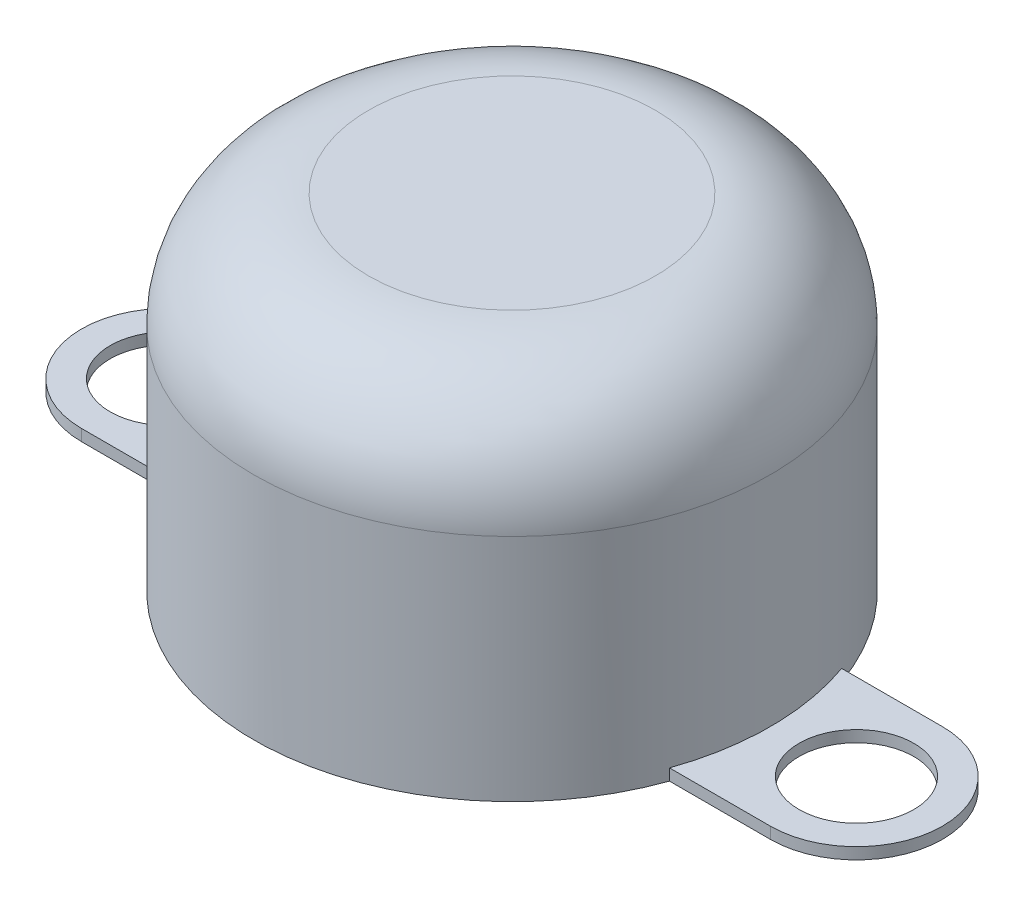
ISO-10303-21;
HEADER;
FILE_DESCRIPTION(('STEP AP214'),'2;1');
FILE_NAME('part.step','',(''),(''),'','','');
FILE_SCHEMA(('AUTOMOTIVE_DESIGN { 1 0 10303 214 1 1 1 1 }'));
ENDSEC;
DATA;
#1=APPLICATION_CONTEXT('core data for automotive mechanical design processes');
#2=APPLICATION_PROTOCOL_DEFINITION('international standard','automotive_design',2000,#1);
#3=PRODUCT_CONTEXT('',#1,'mechanical');
#4=PRODUCT('Part','Part','',(#3));
#5=PRODUCT_RELATED_PRODUCT_CATEGORY('part','',(#4));
#6=PRODUCT_DEFINITION_FORMATION('','',#4);
#7=PRODUCT_DEFINITION_CONTEXT('part definition',#1,'design');
#8=PRODUCT_DEFINITION('design','',#6,#7);
#9=PRODUCT_DEFINITION_SHAPE('','',#8);
#10=(LENGTH_UNIT() NAMED_UNIT(*) SI_UNIT(.MILLI.,.METRE.));
#11=(NAMED_UNIT(*) PLANE_ANGLE_UNIT() SI_UNIT($,.RADIAN.));
#12=(NAMED_UNIT(*) SI_UNIT($,.STERADIAN.) SOLID_ANGLE_UNIT());
#13=UNCERTAINTY_MEASURE_WITH_UNIT(LENGTH_MEASURE(1.E-05),#10,'distance_accuracy_value','');
#14=(GEOMETRIC_REPRESENTATION_CONTEXT(3) GLOBAL_UNCERTAINTY_ASSIGNED_CONTEXT((#13)) GLOBAL_UNIT_ASSIGNED_CONTEXT((#10,
#11,#12)) REPRESENTATION_CONTEXT('',''));
#15=CARTESIAN_POINT('',(0.,0.,0.));
#16=DIRECTION('',(0.,0.,1.));
#17=DIRECTION('',(1.,0.,0.));
#18=AXIS2_PLACEMENT_3D('',#15,#16,#17);
#19=CARTESIAN_POINT('',(0.,30.,0.));
#20=DIRECTION('',(0.,-1.,0.));
#21=DIRECTION('',(0.,0.,-1.));
#22=AXIS2_PLACEMENT_3D('',#19,#20,#21);
#23=CYLINDRICAL_SURFACE('',#22,22.5);
#24=CARTESIAN_POINT('',(0.,20.,0.));
#25=DIRECTION('',(0.,1.,0.));
#26=DIRECTION('',(0.,0.,1.));
#27=AXIS2_PLACEMENT_3D('',#24,#25,#26);
#28=CIRCLE('',#27,22.5);
#29=CARTESIAN_POINT('',(0.,20.,22.5));
#30=VERTEX_POINT('',#29);
#31=EDGE_CURVE('E11',#30,#30,#28,.F.);
#32=ORIENTED_EDGE('',*,*,#31,.T.);
#33=EDGE_LOOP('',(#32));
#34=FACE_BOUND('',#33,.T.);
#35=DIRECTION('',(0.,-1.,0.));
#36=VECTOR('',#35,1.);
#37=CARTESIAN_POINT('',(21.2132034355964,1.,7.5));
#38=LINE('',#37,#36);
#39=CARTESIAN_POINT('',(21.2132034355964,1.,7.5));
#40=VERTEX_POINT('',#39);
#41=CARTESIAN_POINT('',(21.2132034355964,0.,7.5));
#42=VERTEX_POINT('',#41);
#43=EDGE_CURVE('E56',#40,#42,#38,.T.);
#44=ORIENTED_EDGE('',*,*,#43,.F.);
#45=CARTESIAN_POINT('',(0.,1.,0.));
#46=DIRECTION('',(0.,-1.,0.));
#47=DIRECTION('',(0.,0.,1.));
#48=AXIS2_PLACEMENT_3D('',#45,#46,#47);
#49=CIRCLE('',#48,22.5);
#50=CARTESIAN_POINT('',(21.2132034355964,1.,-7.5));
#51=VERTEX_POINT('',#50);
#52=EDGE_CURVE('E51',#51,#40,#49,.T.);
#53=ORIENTED_EDGE('',*,*,#52,.F.);
#54=DIRECTION('',(0.,-1.,0.));
#55=VECTOR('',#54,1.);
#56=CARTESIAN_POINT('',(21.2132034355964,1.,-7.5));
#57=LINE('',#56,#55);
#58=CARTESIAN_POINT('',(21.2132034355964,0.,-7.5));
#59=VERTEX_POINT('',#58);
#60=EDGE_CURVE('E138',#51,#59,#57,.T.);
#61=ORIENTED_EDGE('',*,*,#60,.T.);
#62=CARTESIAN_POINT('',(0.,0.,0.));
#63=DIRECTION('',(0.,1.,0.));
#64=DIRECTION('',(0.,0.,1.));
#65=AXIS2_PLACEMENT_3D('',#62,#63,#64);
#66=CIRCLE('',#65,22.5);
#67=CARTESIAN_POINT('',(-21.2132034355964,0.,-7.5));
#68=VERTEX_POINT('',#67);
#69=EDGE_CURVE('E180',#59,#68,#66,.T.);
#70=ORIENTED_EDGE('',*,*,#69,.T.);
#71=DIRECTION('',(0.,-1.,0.));
#72=VECTOR('',#71,1.);
#73=CARTESIAN_POINT('',(-21.2132034355964,1.,-7.5));
#74=LINE('',#73,#72);
#75=CARTESIAN_POINT('',(-21.2132034355964,1.,-7.5));
#76=VERTEX_POINT('',#75);
#77=EDGE_CURVE('E170',#76,#68,#74,.T.);
#78=ORIENTED_EDGE('',*,*,#77,.F.);
#79=CARTESIAN_POINT('',(0.,1.,0.));
#80=DIRECTION('',(0.,1.,0.));
#81=DIRECTION('',(0.,0.,1.));
#82=AXIS2_PLACEMENT_3D('',#79,#80,#81);
#83=CIRCLE('',#82,22.5);
#84=CARTESIAN_POINT('',(-21.2132034355964,1.,7.5));
#85=VERTEX_POINT('',#84);
#86=EDGE_CURVE('E148',#76,#85,#83,.T.);
#87=ORIENTED_EDGE('',*,*,#86,.T.);
#88=DIRECTION('',(0.,-1.,0.));
#89=VECTOR('',#88,1.);
#90=CARTESIAN_POINT('',(-21.2132034355964,1.,7.5));
#91=LINE('',#90,#89);
#92=CARTESIAN_POINT('',(-21.2132034355964,0.,7.5));
#93=VERTEX_POINT('',#92);
#94=EDGE_CURVE('E173',#85,#93,#91,.T.);
#95=ORIENTED_EDGE('',*,*,#94,.T.);
#96=EDGE_CURVE('E186',#93,#42,#66,.T.);
#97=ORIENTED_EDGE('',*,*,#96,.T.);
#98=EDGE_LOOP('',(#44,#53,#61,#70,#78,#87,#95,#97));
#99=FACE_BOUND('',#98,.T.);
#100=ADVANCED_FACE('F36',(#34,#99),#23,.T.);
#101=CARTESIAN_POINT('',(0.,30.,0.));
#102=DIRECTION('',(0.,1.,0.));
#103=DIRECTION('',(0.,0.,1.));
#104=AXIS2_PLACEMENT_3D('',#101,#102,#103);
#105=PLANE('',#104);
#106=CARTESIAN_POINT('',(0.,30.,0.));
#107=DIRECTION('',(0.,1.,0.));
#108=DIRECTION('',(0.,0.,1.));
#109=AXIS2_PLACEMENT_3D('',#106,#107,#108);
#110=CIRCLE('',#109,12.5);
#111=CARTESIAN_POINT('',(0.,30.,12.5));
#112=VERTEX_POINT('',#111);
#113=EDGE_CURVE('E44',#112,#112,#110,.T.);
#114=ORIENTED_EDGE('',*,*,#113,.T.);
#115=EDGE_LOOP('',(#114));
#116=FACE_BOUND('',#115,.T.);
#117=ADVANCED_FACE('F190',(#116),#105,.T.);
#118=CARTESIAN_POINT('',(0.,0.,0.));
#119=DIRECTION('',(0.,1.,0.));
#120=DIRECTION('',(0.,0.,1.));
#121=AXIS2_PLACEMENT_3D('',#118,#119,#120);
#122=PLANE('',#121);
#123=CARTESIAN_POINT('',(0.,0.,0.));
#124=DIRECTION('',(0.,1.,0.));
#125=DIRECTION('',(0.,0.,1.));
#126=AXIS2_PLACEMENT_3D('',#123,#124,#125);
#127=CIRCLE('',#126,21.5);
#128=CARTESIAN_POINT('',(0.,0.,21.5));
#129=VERTEX_POINT('',#128);
#130=EDGE_CURVE('E176',#129,#129,#127,.T.);
#131=ORIENTED_EDGE('',*,*,#130,.T.);
#132=EDGE_LOOP('',(#131));
#133=FACE_BOUND('',#132,.T.);
#134=ORIENTED_EDGE('',*,*,#96,.F.);
#135=DIRECTION('',(-1.,0.,0.));
#136=VECTOR('',#135,1.);
#137=CARTESIAN_POINT('',(0.,0.,7.5));
#138=LINE('',#137,#136);
#139=CARTESIAN_POINT('',(-30.,0.,7.5));
#140=VERTEX_POINT('',#139);
#141=EDGE_CURVE('E158',#93,#140,#138,.T.);
#142=ORIENTED_EDGE('',*,*,#141,.T.);
#143=CARTESIAN_POINT('',(-30.,0.,0.));
#144=DIRECTION('',(0.,1.,0.));
#145=DIRECTION('',(0.,0.,1.));
#146=AXIS2_PLACEMENT_3D('',#143,#144,#145);
#147=CIRCLE('',#146,7.5);
#148=CARTESIAN_POINT('',(-30.,0.,-7.5));
#149=VERTEX_POINT('',#148);
#150=EDGE_CURVE('E145',#149,#140,#147,.T.);
#151=ORIENTED_EDGE('',*,*,#150,.F.);
#152=DIRECTION('',(-1.,0.,0.));
#153=VECTOR('',#152,1.);
#154=CARTESIAN_POINT('',(0.,0.,-7.5));
#155=LINE('',#154,#153);
#156=EDGE_CURVE('E161',#68,#149,#155,.T.);
#157=ORIENTED_EDGE('',*,*,#156,.F.);
#158=ORIENTED_EDGE('',*,*,#69,.F.);
#159=DIRECTION('',(1.,0.,0.));
#160=VECTOR('',#159,1.);
#161=CARTESIAN_POINT('',(0.,0.,-7.5));
#162=LINE('',#161,#160);
#163=CARTESIAN_POINT('',(30.,0.,-7.5));
#164=VERTEX_POINT('',#163);
#165=EDGE_CURVE('E134',#59,#164,#162,.T.);
#166=ORIENTED_EDGE('',*,*,#165,.T.);
#167=CARTESIAN_POINT('',(30.,0.,0.));
#168=DIRECTION('',(0.,-1.,0.));
#169=DIRECTION('',(0.,0.,1.));
#170=AXIS2_PLACEMENT_3D('',#167,#168,#169);
#171=CIRCLE('',#170,7.5);
#172=CARTESIAN_POINT('',(30.,0.,7.5));
#173=VERTEX_POINT('',#172);
#174=EDGE_CURVE('E132',#164,#173,#171,.T.);
#175=ORIENTED_EDGE('',*,*,#174,.T.);
#176=DIRECTION('',(1.,0.,0.));
#177=VECTOR('',#176,1.);
#178=CARTESIAN_POINT('',(0.,0.,7.5));
#179=LINE('',#178,#177);
#180=EDGE_CURVE('E114',#42,#173,#179,.T.);
#181=ORIENTED_EDGE('',*,*,#180,.F.);
#182=EDGE_LOOP('',(#134,#142,#151,#157,#158,#166,#175,#181));
#183=FACE_BOUND('',#182,.T.);
#184=CARTESIAN_POINT('',(-30.,0.,0.));
#185=DIRECTION('',(0.,1.,0.));
#186=DIRECTION('',(0.,0.,1.));
#187=AXIS2_PLACEMENT_3D('',#184,#185,#186);
#188=CIRCLE('',#187,5.);
#189=CARTESIAN_POINT('',(-30.,0.,5.));
#190=VERTEX_POINT('',#189);
#191=EDGE_CURVE('E118',#190,#190,#188,.T.);
#192=ORIENTED_EDGE('',*,*,#191,.T.);
#193=EDGE_LOOP('',(#192));
#194=FACE_BOUND('',#193,.T.);
#195=CARTESIAN_POINT('',(30.,0.,0.));
#196=DIRECTION('',(0.,-1.,0.));
#197=DIRECTION('',(0.,0.,1.));
#198=AXIS2_PLACEMENT_3D('',#195,#196,#197);
#199=CIRCLE('',#198,5.);
#200=CARTESIAN_POINT('',(30.,0.,5.));
#201=VERTEX_POINT('',#200);
#202=EDGE_CURVE('E128',#201,#201,#199,.T.);
#203=ORIENTED_EDGE('',*,*,#202,.F.);
#204=EDGE_LOOP('',(#203));
#205=FACE_BOUND('',#204,.T.);
#206=ADVANCED_FACE('F194',(#133,#183,#194,#205),#122,.F.);
#207=CARTESIAN_POINT('',(0.,20.,0.));
#208=DIRECTION('',(0.,1.,0.));
#209=DIRECTION('',(0.,0.,1.));
#210=AXIS2_PLACEMENT_3D('',#207,#208,#209);
#211=TOROIDAL_SURFACE('',#210,12.5,10.);
#212=ORIENTED_EDGE('',*,*,#31,.F.);
#213=EDGE_LOOP('',(#212));
#214=FACE_BOUND('',#213,.T.);
#215=ORIENTED_EDGE('',*,*,#113,.F.);
#216=EDGE_LOOP('',(#215));
#217=FACE_BOUND('',#216,.T.);
#218=ADVANCED_FACE('F38',(#214,#217),#211,.T.);
#219=CARTESIAN_POINT('',(0.,30.,0.));
#220=DIRECTION('',(0.,-1.,0.));
#221=DIRECTION('',(0.,0.,-1.));
#222=AXIS2_PLACEMENT_3D('',#219,#220,#221);
#223=CYLINDRICAL_SURFACE('',#222,21.5);
#224=CARTESIAN_POINT('',(0.,20.,0.));
#225=DIRECTION('',(0.,-1.,0.));
#226=DIRECTION('',(0.,0.,-1.));
#227=AXIS2_PLACEMENT_3D('',#224,#225,#226);
#228=CIRCLE('',#227,21.5);
#229=CARTESIAN_POINT('',(0.,20.,-21.5));
#230=VERTEX_POINT('',#229);
#231=EDGE_CURVE('E177',#230,#230,#228,.T.);
#232=ORIENTED_EDGE('',*,*,#231,.F.);
#233=EDGE_LOOP('',(#232));
#234=FACE_BOUND('',#233,.T.);
#235=ORIENTED_EDGE('',*,*,#130,.F.);
#236=EDGE_LOOP('',(#235));
#237=FACE_BOUND('',#236,.T.);
#238=ADVANCED_FACE('F193',(#234,#237),#223,.F.);
#239=CARTESIAN_POINT('',(0.,29.,0.));
#240=DIRECTION('',(0.,1.,0.));
#241=DIRECTION('',(0.,0.,1.));
#242=AXIS2_PLACEMENT_3D('',#239,#240,#241);
#243=PLANE('',#242);
#244=CARTESIAN_POINT('',(0.,29.,0.));
#245=DIRECTION('',(0.,1.,0.));
#246=DIRECTION('',(0.,0.,1.));
#247=AXIS2_PLACEMENT_3D('',#244,#245,#246);
#248=CIRCLE('',#247,12.5);
#249=CARTESIAN_POINT('',(0.,29.,12.5));
#250=VERTEX_POINT('',#249);
#251=EDGE_CURVE('E181',#250,#250,#248,.T.);
#252=ORIENTED_EDGE('',*,*,#251,.F.);
#253=EDGE_LOOP('',(#252));
#254=FACE_BOUND('',#253,.T.);
#255=ADVANCED_FACE('F200',(#254),#243,.F.);
#256=CARTESIAN_POINT('',(0.,20.,0.));
#257=DIRECTION('',(0.,1.,0.));
#258=DIRECTION('',(0.,0.,1.));
#259=AXIS2_PLACEMENT_3D('',#256,#257,#258);
#260=TOROIDAL_SURFACE('',#259,12.5,9.);
#261=ORIENTED_EDGE('',*,*,#231,.T.);
#262=EDGE_LOOP('',(#261));
#263=FACE_BOUND('',#262,.T.);
#264=ORIENTED_EDGE('',*,*,#251,.T.);
#265=EDGE_LOOP('',(#264));
#266=FACE_BOUND('',#265,.T.);
#267=ADVANCED_FACE('F213',(#263,#266),#260,.F.);
#268=CARTESIAN_POINT('',(0.,1.,7.5));
#269=DIRECTION('',(0.,0.,1.));
#270=DIRECTION('',(1.,0.,0.));
#271=AXIS2_PLACEMENT_3D('',#268,#269,#270);
#272=PLANE('',#271);
#273=ORIENTED_EDGE('',*,*,#141,.F.);
#274=ORIENTED_EDGE('',*,*,#94,.F.);
#275=DIRECTION('',(-1.,0.,0.));
#276=VECTOR('',#275,1.);
#277=CARTESIAN_POINT('',(0.,1.,7.5));
#278=LINE('',#277,#276);
#279=CARTESIAN_POINT('',(-30.,1.,7.5));
#280=VERTEX_POINT('',#279);
#281=EDGE_CURVE('E144',#85,#280,#278,.T.);
#282=ORIENTED_EDGE('',*,*,#281,.T.);
#283=DIRECTION('',(0.,-1.,0.));
#284=VECTOR('',#283,1.);
#285=CARTESIAN_POINT('',(-30.,1.,7.5));
#286=LINE('',#285,#284);
#287=EDGE_CURVE('E155',#280,#140,#286,.T.);
#288=ORIENTED_EDGE('',*,*,#287,.T.);
#289=EDGE_LOOP('',(#273,#274,#282,#288));
#290=FACE_BOUND('',#289,.T.);
#291=ADVANCED_FACE('F216',(#290),#272,.T.);
#292=CARTESIAN_POINT('',(0.,1.,-7.5));
#293=DIRECTION('',(0.,0.,1.));
#294=DIRECTION('',(1.,0.,0.));
#295=AXIS2_PLACEMENT_3D('',#292,#293,#294);
#296=PLANE('',#295);
#297=ORIENTED_EDGE('',*,*,#156,.T.);
#298=DIRECTION('',(0.,-1.,0.));
#299=VECTOR('',#298,1.);
#300=CARTESIAN_POINT('',(-30.,1.,-7.5));
#301=LINE('',#300,#299);
#302=CARTESIAN_POINT('',(-30.,1.,-7.5));
#303=VERTEX_POINT('',#302);
#304=EDGE_CURVE('E167',#303,#149,#301,.T.);
#305=ORIENTED_EDGE('',*,*,#304,.F.);
#306=DIRECTION('',(-1.,0.,0.));
#307=VECTOR('',#306,1.);
#308=CARTESIAN_POINT('',(0.,1.,-7.5));
#309=LINE('',#308,#307);
#310=EDGE_CURVE('E150',#76,#303,#309,.T.);
#311=ORIENTED_EDGE('',*,*,#310,.F.);
#312=ORIENTED_EDGE('',*,*,#77,.T.);
#313=EDGE_LOOP('',(#297,#305,#311,#312));
#314=FACE_BOUND('',#313,.T.);
#315=ADVANCED_FACE('F225',(#314),#296,.F.);
#316=CARTESIAN_POINT('',(-30.,1.,0.));
#317=DIRECTION('',(0.,-1.,0.));
#318=DIRECTION('',(0.,0.,-1.));
#319=AXIS2_PLACEMENT_3D('',#316,#317,#318);
#320=CYLINDRICAL_SURFACE('',#319,5.);
#321=CARTESIAN_POINT('',(-30.,1.,0.));
#322=DIRECTION('',(0.,1.,0.));
#323=DIRECTION('',(0.,0.,1.));
#324=AXIS2_PLACEMENT_3D('',#321,#322,#323);
#325=CIRCLE('',#324,5.);
#326=CARTESIAN_POINT('',(-30.,1.,5.));
#327=VERTEX_POINT('',#326);
#328=EDGE_CURVE('E141',#327,#327,#325,.T.);
#329=ORIENTED_EDGE('',*,*,#328,.T.);
#330=EDGE_LOOP('',(#329));
#331=FACE_BOUND('',#330,.T.);
#332=ORIENTED_EDGE('',*,*,#191,.F.);
#333=EDGE_LOOP('',(#332));
#334=FACE_BOUND('',#333,.T.);
#335=ADVANCED_FACE('F221',(#331,#334),#320,.F.);
#336=CARTESIAN_POINT('',(-30.,1.,0.));
#337=DIRECTION('',(0.,-1.,0.));
#338=DIRECTION('',(0.,0.,-1.));
#339=AXIS2_PLACEMENT_3D('',#336,#337,#338);
#340=CYLINDRICAL_SURFACE('',#339,7.5);
#341=ORIENTED_EDGE('',*,*,#150,.T.);
#342=ORIENTED_EDGE('',*,*,#287,.F.);
#343=CARTESIAN_POINT('',(-30.,1.,0.));
#344=DIRECTION('',(0.,1.,0.));
#345=DIRECTION('',(0.,0.,1.));
#346=AXIS2_PLACEMENT_3D('',#343,#344,#345);
#347=CIRCLE('',#346,7.5);
#348=EDGE_CURVE('E153',#303,#280,#347,.T.);
#349=ORIENTED_EDGE('',*,*,#348,.F.);
#350=ORIENTED_EDGE('',*,*,#304,.T.);
#351=EDGE_LOOP('',(#341,#342,#349,#350));
#352=FACE_BOUND('',#351,.T.);
#353=ADVANCED_FACE('F224',(#352),#340,.T.);
#354=CARTESIAN_POINT('',(0.,1.,0.));
#355=DIRECTION('',(0.,1.,0.));
#356=DIRECTION('',(0.,0.,1.));
#357=AXIS2_PLACEMENT_3D('',#354,#355,#356);
#358=PLANE('',#357);
#359=ORIENTED_EDGE('',*,*,#328,.F.);
#360=EDGE_LOOP('',(#359));
#361=FACE_BOUND('',#360,.T.);
#362=ORIENTED_EDGE('',*,*,#281,.F.);
#363=ORIENTED_EDGE('',*,*,#86,.F.);
#364=ORIENTED_EDGE('',*,*,#310,.T.);
#365=ORIENTED_EDGE('',*,*,#348,.T.);
#366=EDGE_LOOP('',(#362,#363,#364,#365));
#367=FACE_BOUND('',#366,.T.);
#368=ADVANCED_FACE('F235',(#361,#367),#358,.T.);
#369=CARTESIAN_POINT('',(0.,1.,7.5));
#370=DIRECTION('',(0.,0.,-1.));
#371=DIRECTION('',(-1.,0.,0.));
#372=AXIS2_PLACEMENT_3D('',#369,#370,#371);
#373=PLANE('',#372);
#374=ORIENTED_EDGE('',*,*,#180,.T.);
#375=DIRECTION('',(0.,-1.,0.));
#376=VECTOR('',#375,1.);
#377=CARTESIAN_POINT('',(30.,1.,7.5));
#378=LINE('',#377,#376);
#379=CARTESIAN_POINT('',(30.,1.,7.5));
#380=VERTEX_POINT('',#379);
#381=EDGE_CURVE('E111',#380,#173,#378,.T.);
#382=ORIENTED_EDGE('',*,*,#381,.F.);
#383=DIRECTION('',(1.,0.,0.));
#384=VECTOR('',#383,1.);
#385=CARTESIAN_POINT('',(0.,1.,7.5));
#386=LINE('',#385,#384);
#387=EDGE_CURVE('E100',#40,#380,#386,.T.);
#388=ORIENTED_EDGE('',*,*,#387,.F.);
#389=ORIENTED_EDGE('',*,*,#43,.T.);
#390=EDGE_LOOP('',(#374,#382,#388,#389));
#391=FACE_BOUND('',#390,.T.);
#392=ADVANCED_FACE('F112',(#391),#373,.F.);
#393=CARTESIAN_POINT('',(30.,1.,0.));
#394=DIRECTION('',(0.,-1.,0.));
#395=DIRECTION('',(0.,0.,-1.));
#396=AXIS2_PLACEMENT_3D('',#393,#394,#395);
#397=CYLINDRICAL_SURFACE('',#396,7.5);
#398=ORIENTED_EDGE('',*,*,#174,.F.);
#399=DIRECTION('',(0.,-1.,0.));
#400=VECTOR('',#399,1.);
#401=CARTESIAN_POINT('',(30.,1.,-7.5));
#402=LINE('',#401,#400);
#403=CARTESIAN_POINT('',(30.,1.,-7.5));
#404=VERTEX_POINT('',#403);
#405=EDGE_CURVE('E119',#404,#164,#402,.T.);
#406=ORIENTED_EDGE('',*,*,#405,.F.);
#407=CARTESIAN_POINT('',(30.,1.,0.));
#408=DIRECTION('',(0.,-1.,0.));
#409=DIRECTION('',(0.,0.,1.));
#410=AXIS2_PLACEMENT_3D('',#407,#408,#409);
#411=CIRCLE('',#410,7.5);
#412=EDGE_CURVE('E105',#404,#380,#411,.T.);
#413=ORIENTED_EDGE('',*,*,#412,.T.);
#414=ORIENTED_EDGE('',*,*,#381,.T.);
#415=EDGE_LOOP('',(#398,#406,#413,#414));
#416=FACE_BOUND('',#415,.T.);
#417=ADVANCED_FACE('F121',(#416),#397,.T.);
#418=CARTESIAN_POINT('',(0.,1.,-7.5));
#419=DIRECTION('',(0.,0.,-1.));
#420=DIRECTION('',(-1.,0.,0.));
#421=AXIS2_PLACEMENT_3D('',#418,#419,#420);
#422=PLANE('',#421);
#423=ORIENTED_EDGE('',*,*,#165,.F.);
#424=ORIENTED_EDGE('',*,*,#60,.F.);
#425=DIRECTION('',(1.,0.,0.));
#426=VECTOR('',#425,1.);
#427=CARTESIAN_POINT('',(0.,1.,-7.5));
#428=LINE('',#427,#426);
#429=EDGE_CURVE('E122',#51,#404,#428,.T.);
#430=ORIENTED_EDGE('',*,*,#429,.T.);
#431=ORIENTED_EDGE('',*,*,#405,.T.);
#432=EDGE_LOOP('',(#423,#424,#430,#431));
#433=FACE_BOUND('',#432,.T.);
#434=ADVANCED_FACE('F243',(#433),#422,.T.);
#435=CARTESIAN_POINT('',(30.,1.,0.));
#436=DIRECTION('',(0.,-1.,0.));
#437=DIRECTION('',(0.,0.,-1.));
#438=AXIS2_PLACEMENT_3D('',#435,#436,#437);
#439=CYLINDRICAL_SURFACE('',#438,5.);
#440=CARTESIAN_POINT('',(30.,1.,0.));
#441=DIRECTION('',(0.,-1.,0.));
#442=DIRECTION('',(0.,0.,1.));
#443=AXIS2_PLACEMENT_3D('',#440,#441,#442);
#444=CIRCLE('',#443,5.);
#445=CARTESIAN_POINT('',(30.,1.,5.));
#446=VERTEX_POINT('',#445);
#447=EDGE_CURVE('E108',#446,#446,#444,.T.);
#448=ORIENTED_EDGE('',*,*,#447,.F.);
#449=EDGE_LOOP('',(#448));
#450=FACE_BOUND('',#449,.T.);
#451=ORIENTED_EDGE('',*,*,#202,.T.);
#452=EDGE_LOOP('',(#451));
#453=FACE_BOUND('',#452,.T.);
#454=ADVANCED_FACE('F240',(#450,#453),#439,.F.);
#455=CARTESIAN_POINT('',(0.,1.,0.));
#456=DIRECTION('',(0.,1.,0.));
#457=DIRECTION('',(0.,0.,1.));
#458=AXIS2_PLACEMENT_3D('',#455,#456,#457);
#459=PLANE('',#458);
#460=ORIENTED_EDGE('',*,*,#447,.T.);
#461=EDGE_LOOP('',(#460));
#462=FACE_BOUND('',#461,.T.);
#463=ORIENTED_EDGE('',*,*,#387,.T.);
#464=ORIENTED_EDGE('',*,*,#412,.F.);
#465=ORIENTED_EDGE('',*,*,#429,.F.);
#466=ORIENTED_EDGE('',*,*,#52,.T.);
#467=EDGE_LOOP('',(#463,#464,#465,#466));
#468=FACE_BOUND('',#467,.T.);
#469=ADVANCED_FACE('F102',(#462,#468),#459,.T.);
#470=CLOSED_SHELL('',(#100,#117,#206,#218,#238,#255,#267,#291,#315,#335,#353,#368,#392,#417,
#434,#454,#469));
#471=MANIFOLD_SOLID_BREP('B2',#470);
#472=ADVANCED_BREP_SHAPE_REPRESENTATION('',(#18,#471),#14);
#473=SHAPE_DEFINITION_REPRESENTATION(#9,#472);
ENDSEC;
END-ISO-10303-21;
